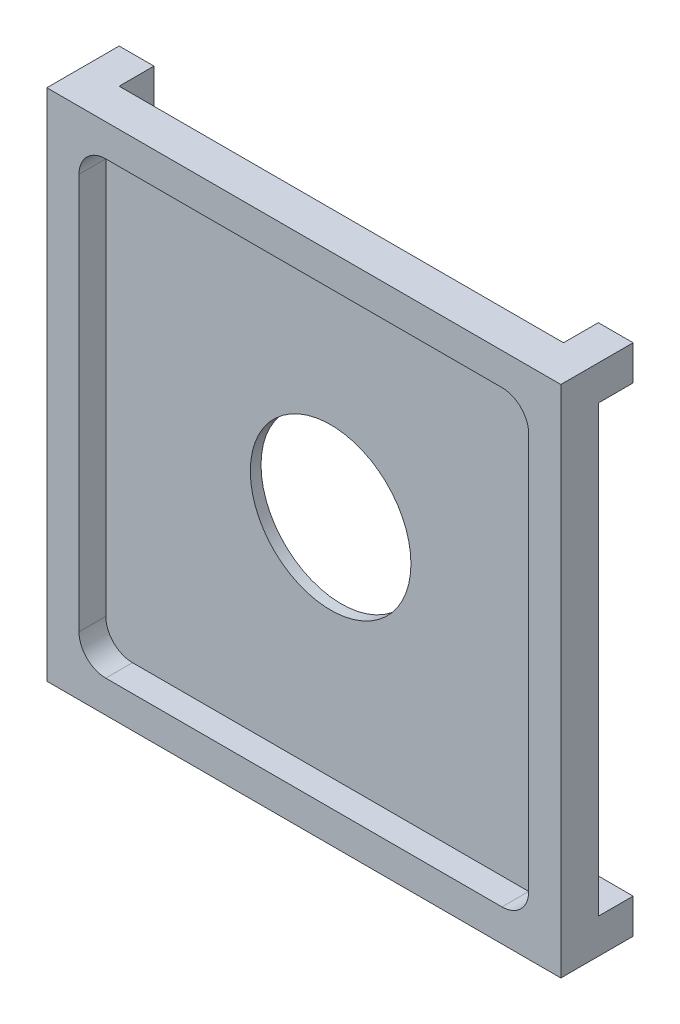
ISO-10303-21;
HEADER;
FILE_DESCRIPTION(('STEP AP214'),'2;1');
FILE_NAME('part.step','',(''),(''),'','','');
FILE_SCHEMA(('AUTOMOTIVE_DESIGN { 1 0 10303 214 1 1 1 1 }'));
ENDSEC;
DATA;
#1=APPLICATION_CONTEXT('core data for automotive mechanical design processes');
#2=APPLICATION_PROTOCOL_DEFINITION('international standard','automotive_design',2000,#1);
#3=PRODUCT_CONTEXT('',#1,'mechanical');
#4=PRODUCT('Part','Part','',(#3));
#5=PRODUCT_RELATED_PRODUCT_CATEGORY('part','',(#4));
#6=PRODUCT_DEFINITION_FORMATION('','',#4);
#7=PRODUCT_DEFINITION_CONTEXT('part definition',#1,'design');
#8=PRODUCT_DEFINITION('design','',#6,#7);
#9=PRODUCT_DEFINITION_SHAPE('','',#8);
#10=(LENGTH_UNIT() NAMED_UNIT(*) SI_UNIT(.MILLI.,.METRE.));
#11=(NAMED_UNIT(*) PLANE_ANGLE_UNIT() SI_UNIT($,.RADIAN.));
#12=(NAMED_UNIT(*) SI_UNIT($,.STERADIAN.) SOLID_ANGLE_UNIT());
#13=UNCERTAINTY_MEASURE_WITH_UNIT(LENGTH_MEASURE(1.E-05),#10,'distance_accuracy_value','');
#14=(GEOMETRIC_REPRESENTATION_CONTEXT(3) GLOBAL_UNCERTAINTY_ASSIGNED_CONTEXT((#13)) GLOBAL_UNIT_ASSIGNED_CONTEXT((#10,
#11,#12)) REPRESENTATION_CONTEXT('',''));
#15=CARTESIAN_POINT('',(0.,0.,0.));
#16=DIRECTION('',(0.,0.,1.));
#17=DIRECTION('',(1.,0.,0.));
#18=AXIS2_PLACEMENT_3D('',#15,#16,#17);
#19=CARTESIAN_POINT('',(0.,0.,0.));
#20=DIRECTION('',(0.,0.,1.));
#21=DIRECTION('',(1.,0.,0.));
#22=AXIS2_PLACEMENT_3D('',#19,#20,#21);
#23=PLANE('',#22);
#24=CARTESIAN_POINT('',(0.,0.,0.));
#25=DIRECTION('',(0.,0.,-1.));
#26=DIRECTION('',(-1.,0.,0.));
#27=AXIS2_PLACEMENT_3D('',#24,#25,#26);
#28=CIRCLE('',#27,15.);
#29=CARTESIAN_POINT('',(-15.,0.,0.));
#30=VERTEX_POINT('',#29);
#31=EDGE_CURVE('E431',#30,#30,#28,.T.);
#32=ORIENTED_EDGE('',*,*,#31,.F.);
#33=EDGE_LOOP('',(#32));
#34=FACE_BOUND('',#33,.T.);
#35=DIRECTION('',(1.,0.,0.));
#36=VECTOR('',#35,1.);
#37=CARTESIAN_POINT('',(-48.,-41.5,0.));
#38=LINE('',#37,#36);
#39=CARTESIAN_POINT('',(-48.,-41.5,0.));
#40=VERTEX_POINT('',#39);
#41=CARTESIAN_POINT('',(-41.5,-41.5,0.));
#42=VERTEX_POINT('',#41);
#43=EDGE_CURVE('E426',#40,#42,#38,.T.);
#44=ORIENTED_EDGE('',*,*,#43,.F.);
#45=DIRECTION('',(0.,-1.,0.));
#46=VECTOR('',#45,1.);
#47=CARTESIAN_POINT('',(-48.,-48.,0.));
#48=LINE('',#47,#46);
#49=CARTESIAN_POINT('',(-48.,41.5,0.));
#50=VERTEX_POINT('',#49);
#51=EDGE_CURVE('E226',#50,#40,#48,.T.);
#52=ORIENTED_EDGE('',*,*,#51,.F.);
#53=DIRECTION('',(-1.,0.,0.));
#54=VECTOR('',#53,1.);
#55=CARTESIAN_POINT('',(-48.,41.5,0.));
#56=LINE('',#55,#54);
#57=CARTESIAN_POINT('',(-41.5,41.5,0.));
#58=VERTEX_POINT('',#57);
#59=EDGE_CURVE('E256',#58,#50,#56,.T.);
#60=ORIENTED_EDGE('',*,*,#59,.F.);
#61=DIRECTION('',(0.,-1.,0.));
#62=VECTOR('',#61,1.);
#63=CARTESIAN_POINT('',(-41.5,48.,0.));
#64=LINE('',#63,#62);
#65=CARTESIAN_POINT('',(-41.5,48.,0.));
#66=VERTEX_POINT('',#65);
#67=EDGE_CURVE('E251',#66,#58,#64,.T.);
#68=ORIENTED_EDGE('',*,*,#67,.F.);
#69=DIRECTION('',(-1.,0.,0.));
#70=VECTOR('',#69,1.);
#71=CARTESIAN_POINT('',(48.,48.,0.));
#72=LINE('',#71,#70);
#73=CARTESIAN_POINT('',(41.5,48.,0.));
#74=VERTEX_POINT('',#73);
#75=EDGE_CURVE('E370',#74,#66,#72,.T.);
#76=ORIENTED_EDGE('',*,*,#75,.F.);
#77=DIRECTION('',(0.,1.,0.));
#78=VECTOR('',#77,1.);
#79=CARTESIAN_POINT('',(41.5,48.,0.));
#80=LINE('',#79,#78);
#81=CARTESIAN_POINT('',(41.5,41.5,0.));
#82=VERTEX_POINT('',#81);
#83=EDGE_CURVE('E276',#82,#74,#80,.T.);
#84=ORIENTED_EDGE('',*,*,#83,.F.);
#85=DIRECTION('',(-1.,0.,0.));
#86=VECTOR('',#85,1.);
#87=CARTESIAN_POINT('',(48.,41.5,0.));
#88=LINE('',#87,#86);
#89=CARTESIAN_POINT('',(48.,41.5,0.));
#90=VERTEX_POINT('',#89);
#91=EDGE_CURVE('E271',#90,#82,#88,.T.);
#92=ORIENTED_EDGE('',*,*,#91,.F.);
#93=DIRECTION('',(0.,1.,0.));
#94=VECTOR('',#93,1.);
#95=CARTESIAN_POINT('',(48.,-48.,0.));
#96=LINE('',#95,#94);
#97=CARTESIAN_POINT('',(48.,-41.5,0.));
#98=VERTEX_POINT('',#97);
#99=EDGE_CURVE('E368',#98,#90,#96,.T.);
#100=ORIENTED_EDGE('',*,*,#99,.F.);
#101=DIRECTION('',(1.,0.,0.));
#102=VECTOR('',#101,1.);
#103=CARTESIAN_POINT('',(48.,-41.5,0.));
#104=LINE('',#103,#102);
#105=CARTESIAN_POINT('',(41.5,-41.5,0.));
#106=VERTEX_POINT('',#105);
#107=EDGE_CURVE('E229',#106,#98,#104,.T.);
#108=ORIENTED_EDGE('',*,*,#107,.F.);
#109=DIRECTION('',(0.,1.,0.));
#110=VECTOR('',#109,1.);
#111=CARTESIAN_POINT('',(41.5,-48.,0.));
#112=LINE('',#111,#110);
#113=CARTESIAN_POINT('',(41.5,-48.,0.));
#114=VERTEX_POINT('',#113);
#115=EDGE_CURVE('E227',#114,#106,#112,.T.);
#116=ORIENTED_EDGE('',*,*,#115,.F.);
#117=DIRECTION('',(1.,0.,0.));
#118=VECTOR('',#117,1.);
#119=CARTESIAN_POINT('',(48.,-48.,0.));
#120=LINE('',#119,#118);
#121=CARTESIAN_POINT('',(-41.5,-48.,0.));
#122=VERTEX_POINT('',#121);
#123=EDGE_CURVE('E366',#122,#114,#120,.T.);
#124=ORIENTED_EDGE('',*,*,#123,.F.);
#125=DIRECTION('',(0.,-1.,0.));
#126=VECTOR('',#125,1.);
#127=CARTESIAN_POINT('',(-41.5,-48.,0.));
#128=LINE('',#127,#126);
#129=EDGE_CURVE('E221',#42,#122,#128,.T.);
#130=ORIENTED_EDGE('',*,*,#129,.F.);
#131=EDGE_LOOP('',(#44,#52,#60,#68,#76,#84,#92,#100,#108,#116,#124,#130));
#132=FACE_BOUND('',#131,.T.);
#133=ADVANCED_FACE('F41',(#34,#132),#23,.F.);
#134=CARTESIAN_POINT('',(-48.,-48.,2.));
#135=DIRECTION('',(1.,0.,0.));
#136=DIRECTION('',(0.,0.,-1.));
#137=AXIS2_PLACEMENT_3D('',#134,#135,#136);
#138=PLANE('',#137);
#139=DIRECTION('',(0.,0.,-1.));
#140=VECTOR('',#139,1.);
#141=CARTESIAN_POINT('',(-48.,48.,2.));
#142=LINE('',#141,#140);
#143=CARTESIAN_POINT('',(-48.,48.,7.));
#144=VERTEX_POINT('',#143);
#145=CARTESIAN_POINT('',(-48.,48.,-6.5));
#146=VERTEX_POINT('',#145);
#147=EDGE_CURVE('E373',#144,#146,#142,.T.);
#148=ORIENTED_EDGE('',*,*,#147,.T.);
#149=DIRECTION('',(0.,1.,0.));
#150=VECTOR('',#149,1.);
#151=CARTESIAN_POINT('',(-48.,48.,-6.5));
#152=LINE('',#151,#150);
#153=CARTESIAN_POINT('',(-48.,41.5,-6.5));
#154=VERTEX_POINT('',#153);
#155=EDGE_CURVE('E252',#154,#146,#152,.T.);
#156=ORIENTED_EDGE('',*,*,#155,.F.);
#157=DIRECTION('',(0.,0.,1.));
#158=VECTOR('',#157,1.);
#159=CARTESIAN_POINT('',(-48.,41.5,-6.5));
#160=LINE('',#159,#158);
#161=EDGE_CURVE('E262',#154,#50,#160,.T.);
#162=ORIENTED_EDGE('',*,*,#161,.T.);
#163=ORIENTED_EDGE('',*,*,#51,.T.);
#164=DIRECTION('',(0.,0.,1.));
#165=VECTOR('',#164,1.);
#166=CARTESIAN_POINT('',(-48.,-41.5,-6.5));
#167=LINE('',#166,#165);
#168=CARTESIAN_POINT('',(-48.,-41.5,-6.5));
#169=VERTEX_POINT('',#168);
#170=EDGE_CURVE('E207',#169,#40,#167,.T.);
#171=ORIENTED_EDGE('',*,*,#170,.F.);
#172=DIRECTION('',(0.,1.,0.));
#173=VECTOR('',#172,1.);
#174=CARTESIAN_POINT('',(-48.,-48.,-6.5));
#175=LINE('',#174,#173);
#176=CARTESIAN_POINT('',(-48.,-48.,-6.5));
#177=VERTEX_POINT('',#176);
#178=EDGE_CURVE('E214',#177,#169,#175,.T.);
#179=ORIENTED_EDGE('',*,*,#178,.F.);
#180=DIRECTION('',(0.,0.,-1.));
#181=VECTOR('',#180,1.);
#182=CARTESIAN_POINT('',(-48.,-48.,2.));
#183=LINE('',#182,#181);
#184=CARTESIAN_POINT('',(-48.,-48.,7.));
#185=VERTEX_POINT('',#184);
#186=EDGE_CURVE('E11',#185,#177,#183,.T.);
#187=ORIENTED_EDGE('',*,*,#186,.F.);
#188=DIRECTION('',(0.,-1.,0.));
#189=VECTOR('',#188,1.);
#190=CARTESIAN_POINT('',(-48.,48.,7.));
#191=LINE('',#190,#189);
#192=EDGE_CURVE('E356',#144,#185,#191,.T.);
#193=ORIENTED_EDGE('',*,*,#192,.F.);
#194=EDGE_LOOP('',(#148,#156,#162,#163,#171,#179,#187,#193));
#195=FACE_BOUND('',#194,.T.);
#196=ADVANCED_FACE('F43',(#195),#138,.F.);
#197=CARTESIAN_POINT('',(48.,-48.,2.));
#198=DIRECTION('',(0.,1.,0.));
#199=DIRECTION('',(-1.,0.,0.));
#200=AXIS2_PLACEMENT_3D('',#197,#198,#199);
#201=PLANE('',#200);
#202=ORIENTED_EDGE('',*,*,#186,.T.);
#203=DIRECTION('',(-1.,0.,0.));
#204=VECTOR('',#203,1.);
#205=CARTESIAN_POINT('',(-48.,-48.,-6.5));
#206=LINE('',#205,#204);
#207=CARTESIAN_POINT('',(-41.5,-48.,-6.5));
#208=VERTEX_POINT('',#207);
#209=EDGE_CURVE('E219',#208,#177,#206,.T.);
#210=ORIENTED_EDGE('',*,*,#209,.F.);
#211=DIRECTION('',(0.,0.,1.));
#212=VECTOR('',#211,1.);
#213=CARTESIAN_POINT('',(-41.5,-48.,-6.5));
#214=LINE('',#213,#212);
#215=EDGE_CURVE('E57',#208,#122,#214,.T.);
#216=ORIENTED_EDGE('',*,*,#215,.T.);
#217=ORIENTED_EDGE('',*,*,#123,.T.);
#218=DIRECTION('',(0.,0.,1.));
#219=VECTOR('',#218,1.);
#220=CARTESIAN_POINT('',(41.5,-48.,-6.5));
#221=LINE('',#220,#219);
#222=CARTESIAN_POINT('',(41.5,-48.,-6.5));
#223=VERTEX_POINT('',#222);
#224=EDGE_CURVE('E248',#223,#114,#221,.T.);
#225=ORIENTED_EDGE('',*,*,#224,.F.);
#226=DIRECTION('',(-1.,0.,0.));
#227=VECTOR('',#226,1.);
#228=CARTESIAN_POINT('',(48.,-48.,-6.5));
#229=LINE('',#228,#227);
#230=CARTESIAN_POINT('',(48.,-48.,-6.5));
#231=VERTEX_POINT('',#230);
#232=EDGE_CURVE('E237',#231,#223,#229,.T.);
#233=ORIENTED_EDGE('',*,*,#232,.F.);
#234=DIRECTION('',(0.,0.,-1.));
#235=VECTOR('',#234,1.);
#236=CARTESIAN_POINT('',(48.,-48.,2.));
#237=LINE('',#236,#235);
#238=CARTESIAN_POINT('',(48.,-48.,7.));
#239=VERTEX_POINT('',#238);
#240=EDGE_CURVE('E50',#239,#231,#237,.T.);
#241=ORIENTED_EDGE('',*,*,#240,.F.);
#242=DIRECTION('',(1.,0.,0.));
#243=VECTOR('',#242,1.);
#244=CARTESIAN_POINT('',(-48.,-48.,7.));
#245=LINE('',#244,#243);
#246=EDGE_CURVE('E359',#185,#239,#245,.T.);
#247=ORIENTED_EDGE('',*,*,#246,.F.);
#248=EDGE_LOOP('',(#202,#210,#216,#217,#225,#233,#241,#247));
#249=FACE_BOUND('',#248,.T.);
#250=ADVANCED_FACE('F382',(#249),#201,.F.);
#251=CARTESIAN_POINT('',(48.,-48.,2.));
#252=DIRECTION('',(-1.,0.,0.));
#253=DIRECTION('',(0.,0.,1.));
#254=AXIS2_PLACEMENT_3D('',#251,#252,#253);
#255=PLANE('',#254);
#256=ORIENTED_EDGE('',*,*,#240,.T.);
#257=DIRECTION('',(0.,-1.,0.));
#258=VECTOR('',#257,1.);
#259=CARTESIAN_POINT('',(48.,-48.,-6.5));
#260=LINE('',#259,#258);
#261=CARTESIAN_POINT('',(48.,-41.5,-6.5));
#262=VERTEX_POINT('',#261);
#263=EDGE_CURVE('E234',#262,#231,#260,.T.);
#264=ORIENTED_EDGE('',*,*,#263,.F.);
#265=DIRECTION('',(0.,0.,1.));
#266=VECTOR('',#265,1.);
#267=CARTESIAN_POINT('',(48.,-41.5,-6.5));
#268=LINE('',#267,#266);
#269=EDGE_CURVE('E65',#262,#98,#268,.T.);
#270=ORIENTED_EDGE('',*,*,#269,.T.);
#271=ORIENTED_EDGE('',*,*,#99,.T.);
#272=DIRECTION('',(0.,0.,1.));
#273=VECTOR('',#272,1.);
#274=CARTESIAN_POINT('',(48.,41.5,-6.5));
#275=LINE('',#274,#273);
#276=CARTESIAN_POINT('',(48.,41.5,-6.5));
#277=VERTEX_POINT('',#276);
#278=EDGE_CURVE('E293',#277,#90,#275,.T.);
#279=ORIENTED_EDGE('',*,*,#278,.F.);
#280=DIRECTION('',(0.,-1.,0.));
#281=VECTOR('',#280,1.);
#282=CARTESIAN_POINT('',(48.,48.,-6.5));
#283=LINE('',#282,#281);
#284=CARTESIAN_POINT('',(48.,48.,-6.5));
#285=VERTEX_POINT('',#284);
#286=EDGE_CURVE('E272',#285,#277,#283,.T.);
#287=ORIENTED_EDGE('',*,*,#286,.F.);
#288=DIRECTION('',(0.,0.,-1.));
#289=VECTOR('',#288,1.);
#290=CARTESIAN_POINT('',(48.,48.,2.));
#291=LINE('',#290,#289);
#292=CARTESIAN_POINT('',(48.,48.,7.));
#293=VERTEX_POINT('',#292);
#294=EDGE_CURVE('E375',#293,#285,#291,.T.);
#295=ORIENTED_EDGE('',*,*,#294,.F.);
#296=DIRECTION('',(0.,1.,0.));
#297=VECTOR('',#296,1.);
#298=CARTESIAN_POINT('',(48.,-48.,7.));
#299=LINE('',#298,#297);
#300=EDGE_CURVE('E362',#239,#293,#299,.T.);
#301=ORIENTED_EDGE('',*,*,#300,.F.);
#302=EDGE_LOOP('',(#256,#264,#270,#271,#279,#287,#295,#301));
#303=FACE_BOUND('',#302,.T.);
#304=ADVANCED_FACE('F379',(#303),#255,.F.);
#305=CARTESIAN_POINT('',(48.,48.,2.));
#306=DIRECTION('',(0.,-1.,0.));
#307=DIRECTION('',(1.,0.,0.));
#308=AXIS2_PLACEMENT_3D('',#305,#306,#307);
#309=PLANE('',#308);
#310=ORIENTED_EDGE('',*,*,#294,.T.);
#311=DIRECTION('',(1.,0.,0.));
#312=VECTOR('',#311,1.);
#313=CARTESIAN_POINT('',(48.,48.,-6.5));
#314=LINE('',#313,#312);
#315=CARTESIAN_POINT('',(41.5,48.,-6.5));
#316=VERTEX_POINT('',#315);
#317=EDGE_CURVE('E280',#316,#285,#314,.T.);
#318=ORIENTED_EDGE('',*,*,#317,.F.);
#319=DIRECTION('',(0.,0.,1.));
#320=VECTOR('',#319,1.);
#321=CARTESIAN_POINT('',(41.5,48.,-6.5));
#322=LINE('',#321,#320);
#323=EDGE_CURVE('E283',#316,#74,#322,.T.);
#324=ORIENTED_EDGE('',*,*,#323,.T.);
#325=ORIENTED_EDGE('',*,*,#75,.T.);
#326=DIRECTION('',(0.,0.,1.));
#327=VECTOR('',#326,1.);
#328=CARTESIAN_POINT('',(-41.5,48.,-6.5));
#329=LINE('',#328,#327);
#330=CARTESIAN_POINT('',(-41.5,48.,-6.5));
#331=VERTEX_POINT('',#330);
#332=EDGE_CURVE('E269',#331,#66,#329,.T.);
#333=ORIENTED_EDGE('',*,*,#332,.F.);
#334=DIRECTION('',(1.,0.,0.));
#335=VECTOR('',#334,1.);
#336=CARTESIAN_POINT('',(-48.,48.,-6.5));
#337=LINE('',#336,#335);
#338=EDGE_CURVE('E255',#146,#331,#337,.T.);
#339=ORIENTED_EDGE('',*,*,#338,.F.);
#340=ORIENTED_EDGE('',*,*,#147,.F.);
#341=DIRECTION('',(-1.,0.,0.));
#342=VECTOR('',#341,1.);
#343=CARTESIAN_POINT('',(48.,48.,7.));
#344=LINE('',#343,#342);
#345=EDGE_CURVE('E353',#293,#144,#344,.T.);
#346=ORIENTED_EDGE('',*,*,#345,.F.);
#347=EDGE_LOOP('',(#310,#318,#324,#325,#333,#339,#340,#346));
#348=FACE_BOUND('',#347,.T.);
#349=ADVANCED_FACE('F406',(#348),#309,.F.);
#350=CARTESIAN_POINT('',(0.,0.,7.));
#351=DIRECTION('',(0.,0.,1.));
#352=DIRECTION('',(1.,0.,0.));
#353=AXIS2_PLACEMENT_3D('',#350,#351,#352);
#354=PLANE('',#353);
#355=ORIENTED_EDGE('',*,*,#345,.T.);
#356=ORIENTED_EDGE('',*,*,#192,.T.);
#357=ORIENTED_EDGE('',*,*,#246,.T.);
#358=ORIENTED_EDGE('',*,*,#300,.T.);
#359=EDGE_LOOP('',(#355,#356,#357,#358));
#360=FACE_BOUND('',#359,.T.);
#361=DIRECTION('',(1.,0.,0.));
#362=VECTOR('',#361,1.);
#363=CARTESIAN_POINT('',(37.,-42.,7.));
#364=LINE('',#363,#362);
#365=CARTESIAN_POINT('',(-37.,-42.,7.));
#366=VERTEX_POINT('',#365);
#367=CARTESIAN_POINT('',(37.,-42.,7.));
#368=VERTEX_POINT('',#367);
#369=EDGE_CURVE('E299',#366,#368,#364,.T.);
#370=ORIENTED_EDGE('',*,*,#369,.F.);
#371=CARTESIAN_POINT('',(-37.,-37.,7.));
#372=DIRECTION('',(0.,0.,1.));
#373=DIRECTION('',(-1.,0.,0.));
#374=AXIS2_PLACEMENT_3D('',#371,#372,#373);
#375=CIRCLE('',#374,5.);
#376=CARTESIAN_POINT('',(-42.,-37.,7.));
#377=VERTEX_POINT('',#376);
#378=EDGE_CURVE('E297',#377,#366,#375,.T.);
#379=ORIENTED_EDGE('',*,*,#378,.F.);
#380=DIRECTION('',(0.,-1.,0.));
#381=VECTOR('',#380,1.);
#382=CARTESIAN_POINT('',(-42.,-37.,7.));
#383=LINE('',#382,#381);
#384=CARTESIAN_POINT('',(-42.,37.,7.));
#385=VERTEX_POINT('',#384);
#386=EDGE_CURVE('E313',#385,#377,#383,.T.);
#387=ORIENTED_EDGE('',*,*,#386,.F.);
#388=CARTESIAN_POINT('',(-37.,37.,7.));
#389=DIRECTION('',(0.,0.,1.));
#390=DIRECTION('',(1.,0.,0.));
#391=AXIS2_PLACEMENT_3D('',#388,#389,#390);
#392=CIRCLE('',#391,5.);
#393=CARTESIAN_POINT('',(-37.,42.,7.));
#394=VERTEX_POINT('',#393);
#395=EDGE_CURVE('E310',#394,#385,#392,.T.);
#396=ORIENTED_EDGE('',*,*,#395,.F.);
#397=DIRECTION('',(-1.,0.,0.));
#398=VECTOR('',#397,1.);
#399=CARTESIAN_POINT('',(37.,42.,7.));
#400=LINE('',#399,#398);
#401=CARTESIAN_POINT('',(37.,42.,7.));
#402=VERTEX_POINT('',#401);
#403=EDGE_CURVE('E308',#402,#394,#400,.T.);
#404=ORIENTED_EDGE('',*,*,#403,.F.);
#405=CARTESIAN_POINT('',(37.,37.,7.));
#406=DIRECTION('',(0.,0.,1.));
#407=DIRECTION('',(1.,0.,0.));
#408=AXIS2_PLACEMENT_3D('',#405,#406,#407);
#409=CIRCLE('',#408,5.);
#410=CARTESIAN_POINT('',(42.,37.,7.));
#411=VERTEX_POINT('',#410);
#412=EDGE_CURVE('E306',#411,#402,#409,.T.);
#413=ORIENTED_EDGE('',*,*,#412,.F.);
#414=DIRECTION('',(0.,1.,0.));
#415=VECTOR('',#414,1.);
#416=CARTESIAN_POINT('',(42.,-37.,7.));
#417=LINE('',#416,#415);
#418=CARTESIAN_POINT('',(42.,-37.,7.));
#419=VERTEX_POINT('',#418);
#420=EDGE_CURVE('E304',#419,#411,#417,.T.);
#421=ORIENTED_EDGE('',*,*,#420,.F.);
#422=CARTESIAN_POINT('',(37.,-37.,7.));
#423=DIRECTION('',(0.,0.,1.));
#424=DIRECTION('',(1.,0.,0.));
#425=AXIS2_PLACEMENT_3D('',#422,#423,#424);
#426=CIRCLE('',#425,5.);
#427=EDGE_CURVE('E302',#368,#419,#426,.T.);
#428=ORIENTED_EDGE('',*,*,#427,.F.);
#429=EDGE_LOOP('',(#370,#379,#387,#396,#404,#413,#421,#428));
#430=FACE_BOUND('',#429,.T.);
#431=ADVANCED_FACE('F409',(#360,#430),#354,.T.);
#432=CARTESIAN_POINT('',(-37.,-37.,7.));
#433=DIRECTION('',(0.,0.,-1.));
#434=DIRECTION('',(-1.,0.,0.));
#435=AXIS2_PLACEMENT_3D('',#432,#433,#434);
#436=CYLINDRICAL_SURFACE('',#435,5.);
#437=CARTESIAN_POINT('',(-37.,-37.,2.));
#438=DIRECTION('',(0.,0.,1.));
#439=DIRECTION('',(-1.,0.,0.));
#440=AXIS2_PLACEMENT_3D('',#437,#438,#439);
#441=CIRCLE('',#440,5.);
#442=CARTESIAN_POINT('',(-42.,-37.,2.));
#443=VERTEX_POINT('',#442);
#444=CARTESIAN_POINT('',(-37.,-42.,2.));
#445=VERTEX_POINT('',#444);
#446=EDGE_CURVE('E296',#443,#445,#441,.T.);
#447=ORIENTED_EDGE('',*,*,#446,.F.);
#448=DIRECTION('',(0.,0.,-1.));
#449=VECTOR('',#448,1.);
#450=CARTESIAN_POINT('',(-42.,-37.,7.));
#451=LINE('',#450,#449);
#452=EDGE_CURVE('E315',#377,#443,#451,.T.);
#453=ORIENTED_EDGE('',*,*,#452,.F.);
#454=ORIENTED_EDGE('',*,*,#378,.T.);
#455=DIRECTION('',(0.,0.,-1.));
#456=VECTOR('',#455,1.);
#457=CARTESIAN_POINT('',(-37.,-42.,7.));
#458=LINE('',#457,#456);
#459=EDGE_CURVE('E350',#366,#445,#458,.T.);
#460=ORIENTED_EDGE('',*,*,#459,.T.);
#461=EDGE_LOOP('',(#447,#453,#454,#460));
#462=FACE_BOUND('',#461,.T.);
#463=ADVANCED_FACE('F468',(#462),#436,.F.);
#464=CARTESIAN_POINT('',(37.,-42.,7.));
#465=DIRECTION('',(0.,1.,0.));
#466=DIRECTION('',(0.,0.,1.));
#467=AXIS2_PLACEMENT_3D('',#464,#465,#466);
#468=PLANE('',#467);
#469=DIRECTION('',(1.,0.,0.));
#470=VECTOR('',#469,1.);
#471=CARTESIAN_POINT('',(37.,-42.,2.));
#472=LINE('',#471,#470);
#473=CARTESIAN_POINT('',(37.,-42.,2.));
#474=VERTEX_POINT('',#473);
#475=EDGE_CURVE('E317',#445,#474,#472,.T.);
#476=ORIENTED_EDGE('',*,*,#475,.F.);
#477=ORIENTED_EDGE('',*,*,#459,.F.);
#478=ORIENTED_EDGE('',*,*,#369,.T.);
#479=DIRECTION('',(0.,0.,-1.));
#480=VECTOR('',#479,1.);
#481=CARTESIAN_POINT('',(37.,-42.,7.));
#482=LINE('',#481,#480);
#483=EDGE_CURVE('E347',#368,#474,#482,.T.);
#484=ORIENTED_EDGE('',*,*,#483,.T.);
#485=EDGE_LOOP('',(#476,#477,#478,#484));
#486=FACE_BOUND('',#485,.T.);
#487=ADVANCED_FACE('F473',(#486),#468,.T.);
#488=CARTESIAN_POINT('',(37.,-37.,7.));
#489=DIRECTION('',(0.,0.,-1.));
#490=DIRECTION('',(-1.,0.,0.));
#491=AXIS2_PLACEMENT_3D('',#488,#489,#490);
#492=CYLINDRICAL_SURFACE('',#491,5.);
#493=CARTESIAN_POINT('',(37.,-37.,2.));
#494=DIRECTION('',(0.,0.,1.));
#495=DIRECTION('',(1.,0.,0.));
#496=AXIS2_PLACEMENT_3D('',#493,#494,#495);
#497=CIRCLE('',#496,5.);
#498=CARTESIAN_POINT('',(42.,-37.,2.));
#499=VERTEX_POINT('',#498);
#500=EDGE_CURVE('E319',#474,#499,#497,.T.);
#501=ORIENTED_EDGE('',*,*,#500,.F.);
#502=ORIENTED_EDGE('',*,*,#483,.F.);
#503=ORIENTED_EDGE('',*,*,#427,.T.);
#504=DIRECTION('',(0.,0.,-1.));
#505=VECTOR('',#504,1.);
#506=CARTESIAN_POINT('',(42.,-37.,7.));
#507=LINE('',#506,#505);
#508=EDGE_CURVE('E344',#419,#499,#507,.T.);
#509=ORIENTED_EDGE('',*,*,#508,.T.);
#510=EDGE_LOOP('',(#501,#502,#503,#509));
#511=FACE_BOUND('',#510,.T.);
#512=ADVANCED_FACE('F480',(#511),#492,.F.);
#513=CARTESIAN_POINT('',(42.,-37.,7.));
#514=DIRECTION('',(-1.,0.,0.));
#515=DIRECTION('',(0.,0.,1.));
#516=AXIS2_PLACEMENT_3D('',#513,#514,#515);
#517=PLANE('',#516);
#518=DIRECTION('',(0.,1.,0.));
#519=VECTOR('',#518,1.);
#520=CARTESIAN_POINT('',(42.,-37.,2.));
#521=LINE('',#520,#519);
#522=CARTESIAN_POINT('',(42.,37.,2.));
#523=VERTEX_POINT('',#522);
#524=EDGE_CURVE('E321',#499,#523,#521,.T.);
#525=ORIENTED_EDGE('',*,*,#524,.F.);
#526=ORIENTED_EDGE('',*,*,#508,.F.);
#527=ORIENTED_EDGE('',*,*,#420,.T.);
#528=DIRECTION('',(0.,0.,-1.));
#529=VECTOR('',#528,1.);
#530=CARTESIAN_POINT('',(42.,37.,7.));
#531=LINE('',#530,#529);
#532=EDGE_CURVE('E341',#411,#523,#531,.T.);
#533=ORIENTED_EDGE('',*,*,#532,.T.);
#534=EDGE_LOOP('',(#525,#526,#527,#533));
#535=FACE_BOUND('',#534,.T.);
#536=ADVANCED_FACE('F487',(#535),#517,.T.);
#537=CARTESIAN_POINT('',(37.,37.,7.));
#538=DIRECTION('',(0.,0.,-1.));
#539=DIRECTION('',(-1.,0.,0.));
#540=AXIS2_PLACEMENT_3D('',#537,#538,#539);
#541=CYLINDRICAL_SURFACE('',#540,5.);
#542=CARTESIAN_POINT('',(37.,37.,2.));
#543=DIRECTION('',(0.,0.,1.));
#544=DIRECTION('',(1.,0.,0.));
#545=AXIS2_PLACEMENT_3D('',#542,#543,#544);
#546=CIRCLE('',#545,5.);
#547=CARTESIAN_POINT('',(37.,42.,2.));
#548=VERTEX_POINT('',#547);
#549=EDGE_CURVE('E323',#523,#548,#546,.T.);
#550=ORIENTED_EDGE('',*,*,#549,.F.);
#551=ORIENTED_EDGE('',*,*,#532,.F.);
#552=ORIENTED_EDGE('',*,*,#412,.T.);
#553=DIRECTION('',(0.,0.,-1.));
#554=VECTOR('',#553,1.);
#555=CARTESIAN_POINT('',(37.,42.,7.));
#556=LINE('',#555,#554);
#557=EDGE_CURVE('E338',#402,#548,#556,.T.);
#558=ORIENTED_EDGE('',*,*,#557,.T.);
#559=EDGE_LOOP('',(#550,#551,#552,#558));
#560=FACE_BOUND('',#559,.T.);
#561=ADVANCED_FACE('F494',(#560),#541,.F.);
#562=CARTESIAN_POINT('',(37.,42.,7.));
#563=DIRECTION('',(0.,-1.,0.));
#564=DIRECTION('',(0.,0.,-1.));
#565=AXIS2_PLACEMENT_3D('',#562,#563,#564);
#566=PLANE('',#565);
#567=DIRECTION('',(-1.,0.,0.));
#568=VECTOR('',#567,1.);
#569=CARTESIAN_POINT('',(37.,42.,2.));
#570=LINE('',#569,#568);
#571=CARTESIAN_POINT('',(-37.,42.,2.));
#572=VERTEX_POINT('',#571);
#573=EDGE_CURVE('E325',#548,#572,#570,.T.);
#574=ORIENTED_EDGE('',*,*,#573,.F.);
#575=ORIENTED_EDGE('',*,*,#557,.F.);
#576=ORIENTED_EDGE('',*,*,#403,.T.);
#577=DIRECTION('',(0.,0.,-1.));
#578=VECTOR('',#577,1.);
#579=CARTESIAN_POINT('',(-37.,42.,7.));
#580=LINE('',#579,#578);
#581=EDGE_CURVE('E335',#394,#572,#580,.T.);
#582=ORIENTED_EDGE('',*,*,#581,.T.);
#583=EDGE_LOOP('',(#574,#575,#576,#582));
#584=FACE_BOUND('',#583,.T.);
#585=ADVANCED_FACE('F501',(#584),#566,.T.);
#586=CARTESIAN_POINT('',(-37.,37.,7.));
#587=DIRECTION('',(0.,0.,-1.));
#588=DIRECTION('',(-1.,0.,0.));
#589=AXIS2_PLACEMENT_3D('',#586,#587,#588);
#590=CYLINDRICAL_SURFACE('',#589,5.);
#591=CARTESIAN_POINT('',(-37.,37.,2.));
#592=DIRECTION('',(0.,0.,1.));
#593=DIRECTION('',(1.,0.,0.));
#594=AXIS2_PLACEMENT_3D('',#591,#592,#593);
#595=CIRCLE('',#594,5.);
#596=CARTESIAN_POINT('',(-42.,37.,2.));
#597=VERTEX_POINT('',#596);
#598=EDGE_CURVE('E327',#572,#597,#595,.T.);
#599=ORIENTED_EDGE('',*,*,#598,.F.);
#600=ORIENTED_EDGE('',*,*,#581,.F.);
#601=ORIENTED_EDGE('',*,*,#395,.T.);
#602=DIRECTION('',(0.,0.,-1.));
#603=VECTOR('',#602,1.);
#604=CARTESIAN_POINT('',(-42.,37.,7.));
#605=LINE('',#604,#603);
#606=EDGE_CURVE('E332',#385,#597,#605,.T.);
#607=ORIENTED_EDGE('',*,*,#606,.T.);
#608=EDGE_LOOP('',(#599,#600,#601,#607));
#609=FACE_BOUND('',#608,.T.);
#610=ADVANCED_FACE('F508',(#609),#590,.F.);
#611=CARTESIAN_POINT('',(-42.,-37.,7.));
#612=DIRECTION('',(1.,0.,0.));
#613=DIRECTION('',(0.,0.,-1.));
#614=AXIS2_PLACEMENT_3D('',#611,#612,#613);
#615=PLANE('',#614);
#616=DIRECTION('',(0.,-1.,0.));
#617=VECTOR('',#616,1.);
#618=CARTESIAN_POINT('',(-42.,-37.,2.));
#619=LINE('',#618,#617);
#620=EDGE_CURVE('E300',#597,#443,#619,.T.);
#621=ORIENTED_EDGE('',*,*,#620,.F.);
#622=ORIENTED_EDGE('',*,*,#606,.F.);
#623=ORIENTED_EDGE('',*,*,#386,.T.);
#624=ORIENTED_EDGE('',*,*,#452,.T.);
#625=EDGE_LOOP('',(#621,#622,#623,#624));
#626=FACE_BOUND('',#625,.T.);
#627=ADVANCED_FACE('F515',(#626),#615,.T.);
#628=CARTESIAN_POINT('',(0.,0.,2.));
#629=DIRECTION('',(0.,0.,1.));
#630=DIRECTION('',(1.,0.,0.));
#631=AXIS2_PLACEMENT_3D('',#628,#629,#630);
#632=PLANE('',#631);
#633=CARTESIAN_POINT('',(0.,0.,2.));
#634=DIRECTION('',(0.,0.,1.));
#635=DIRECTION('',(1.,0.,0.));
#636=AXIS2_PLACEMENT_3D('',#633,#634,#635);
#637=CIRCLE('',#636,15.);
#638=CARTESIAN_POINT('',(15.,0.,2.));
#639=VERTEX_POINT('',#638);
#640=EDGE_CURVE('E45',#639,#639,#637,.T.);
#641=ORIENTED_EDGE('',*,*,#640,.F.);
#642=EDGE_LOOP('',(#641));
#643=FACE_BOUND('',#642,.T.);
#644=ORIENTED_EDGE('',*,*,#446,.T.);
#645=ORIENTED_EDGE('',*,*,#475,.T.);
#646=ORIENTED_EDGE('',*,*,#500,.T.);
#647=ORIENTED_EDGE('',*,*,#524,.T.);
#648=ORIENTED_EDGE('',*,*,#549,.T.);
#649=ORIENTED_EDGE('',*,*,#573,.T.);
#650=ORIENTED_EDGE('',*,*,#598,.T.);
#651=ORIENTED_EDGE('',*,*,#620,.T.);
#652=EDGE_LOOP('',(#644,#645,#646,#647,#648,#649,#650,#651));
#653=FACE_BOUND('',#652,.T.);
#654=ADVANCED_FACE('F447',(#643,#653),#632,.T.);
#655=CARTESIAN_POINT('',(48.,41.5,-6.5));
#656=DIRECTION('',(0.,1.,0.));
#657=DIRECTION('',(0.,0.,1.));
#658=AXIS2_PLACEMENT_3D('',#655,#656,#657);
#659=PLANE('',#658);
#660=ORIENTED_EDGE('',*,*,#91,.T.);
#661=DIRECTION('',(0.,0.,1.));
#662=VECTOR('',#661,1.);
#663=CARTESIAN_POINT('',(41.5,41.5,-6.5));
#664=LINE('',#663,#662);
#665=CARTESIAN_POINT('',(41.5,41.5,-6.5));
#666=VERTEX_POINT('',#665);
#667=EDGE_CURVE('E290',#666,#82,#664,.T.);
#668=ORIENTED_EDGE('',*,*,#667,.F.);
#669=DIRECTION('',(-1.,0.,0.));
#670=VECTOR('',#669,1.);
#671=CARTESIAN_POINT('',(48.,41.5,-6.5));
#672=LINE('',#671,#670);
#673=EDGE_CURVE('E275',#277,#666,#672,.T.);
#674=ORIENTED_EDGE('',*,*,#673,.F.);
#675=ORIENTED_EDGE('',*,*,#278,.T.);
#676=EDGE_LOOP('',(#660,#668,#674,#675));
#677=FACE_BOUND('',#676,.T.);
#678=ADVANCED_FACE('F398',(#677),#659,.F.);
#679=CARTESIAN_POINT('',(41.5,48.,-6.5));
#680=DIRECTION('',(1.,0.,0.));
#681=DIRECTION('',(0.,0.,-1.));
#682=AXIS2_PLACEMENT_3D('',#679,#680,#681);
#683=PLANE('',#682);
#684=ORIENTED_EDGE('',*,*,#83,.T.);
#685=ORIENTED_EDGE('',*,*,#323,.F.);
#686=DIRECTION('',(0.,1.,0.));
#687=VECTOR('',#686,1.);
#688=CARTESIAN_POINT('',(41.5,48.,-6.5));
#689=LINE('',#688,#687);
#690=EDGE_CURVE('E278',#666,#316,#689,.T.);
#691=ORIENTED_EDGE('',*,*,#690,.F.);
#692=ORIENTED_EDGE('',*,*,#667,.T.);
#693=EDGE_LOOP('',(#684,#685,#691,#692));
#694=FACE_BOUND('',#693,.T.);
#695=ADVANCED_FACE('F533',(#694),#683,.F.);
#696=CARTESIAN_POINT('',(0.,0.,-6.5));
#697=DIRECTION('',(0.,0.,-1.));
#698=DIRECTION('',(-1.,0.,0.));
#699=AXIS2_PLACEMENT_3D('',#696,#697,#698);
#700=PLANE('',#699);
#701=ORIENTED_EDGE('',*,*,#286,.T.);
#702=ORIENTED_EDGE('',*,*,#673,.T.);
#703=ORIENTED_EDGE('',*,*,#690,.T.);
#704=ORIENTED_EDGE('',*,*,#317,.T.);
#705=EDGE_LOOP('',(#701,#702,#703,#704));
#706=FACE_BOUND('',#705,.T.);
#707=ADVANCED_FACE('F402',(#706),#700,.T.);
#708=CARTESIAN_POINT('',(-41.5,48.,-6.5));
#709=DIRECTION('',(-1.,0.,0.));
#710=DIRECTION('',(0.,0.,1.));
#711=AXIS2_PLACEMENT_3D('',#708,#709,#710);
#712=PLANE('',#711);
#713=ORIENTED_EDGE('',*,*,#67,.T.);
#714=DIRECTION('',(0.,0.,1.));
#715=VECTOR('',#714,1.);
#716=CARTESIAN_POINT('',(-41.5,41.5,-6.5));
#717=LINE('',#716,#715);
#718=CARTESIAN_POINT('',(-41.5,41.5,-6.5));
#719=VERTEX_POINT('',#718);
#720=EDGE_CURVE('E266',#719,#58,#717,.T.);
#721=ORIENTED_EDGE('',*,*,#720,.F.);
#722=DIRECTION('',(0.,-1.,0.));
#723=VECTOR('',#722,1.);
#724=CARTESIAN_POINT('',(-41.5,48.,-6.5));
#725=LINE('',#724,#723);
#726=EDGE_CURVE('E258',#331,#719,#725,.T.);
#727=ORIENTED_EDGE('',*,*,#726,.F.);
#728=ORIENTED_EDGE('',*,*,#332,.T.);
#729=EDGE_LOOP('',(#713,#721,#727,#728));
#730=FACE_BOUND('',#729,.T.);
#731=ADVANCED_FACE('F545',(#730),#712,.F.);
#732=CARTESIAN_POINT('',(-48.,41.5,-6.5));
#733=DIRECTION('',(0.,1.,0.));
#734=DIRECTION('',(0.,0.,1.));
#735=AXIS2_PLACEMENT_3D('',#732,#733,#734);
#736=PLANE('',#735);
#737=ORIENTED_EDGE('',*,*,#59,.T.);
#738=ORIENTED_EDGE('',*,*,#161,.F.);
#739=DIRECTION('',(-1.,0.,0.));
#740=VECTOR('',#739,1.);
#741=CARTESIAN_POINT('',(-48.,41.5,-6.5));
#742=LINE('',#741,#740);
#743=EDGE_CURVE('E260',#719,#154,#742,.T.);
#744=ORIENTED_EDGE('',*,*,#743,.F.);
#745=ORIENTED_EDGE('',*,*,#720,.T.);
#746=EDGE_LOOP('',(#737,#738,#744,#745));
#747=FACE_BOUND('',#746,.T.);
#748=ADVANCED_FACE('F422',(#747),#736,.F.);
#749=CARTESIAN_POINT('',(0.,0.,-6.5));
#750=DIRECTION('',(0.,0.,1.));
#751=DIRECTION('',(1.,0.,0.));
#752=AXIS2_PLACEMENT_3D('',#749,#750,#751);
#753=PLANE('',#752);
#754=ORIENTED_EDGE('',*,*,#155,.T.);
#755=ORIENTED_EDGE('',*,*,#338,.T.);
#756=ORIENTED_EDGE('',*,*,#726,.T.);
#757=ORIENTED_EDGE('',*,*,#743,.T.);
#758=EDGE_LOOP('',(#754,#755,#756,#757));
#759=FACE_BOUND('',#758,.T.);
#760=ADVANCED_FACE('F417',(#759),#753,.F.);
#761=CARTESIAN_POINT('',(41.5,-48.,-6.5));
#762=DIRECTION('',(1.,0.,0.));
#763=DIRECTION('',(0.,0.,-1.));
#764=AXIS2_PLACEMENT_3D('',#761,#762,#763);
#765=PLANE('',#764);
#766=ORIENTED_EDGE('',*,*,#115,.T.);
#767=DIRECTION('',(0.,0.,1.));
#768=VECTOR('',#767,1.);
#769=CARTESIAN_POINT('',(41.5,-41.5,-6.5));
#770=LINE('',#769,#768);
#771=CARTESIAN_POINT('',(41.5,-41.5,-6.5));
#772=VERTEX_POINT('',#771);
#773=EDGE_CURVE('E245',#772,#106,#770,.T.);
#774=ORIENTED_EDGE('',*,*,#773,.F.);
#775=DIRECTION('',(0.,1.,0.));
#776=VECTOR('',#775,1.);
#777=CARTESIAN_POINT('',(41.5,-48.,-6.5));
#778=LINE('',#777,#776);
#779=EDGE_CURVE('E239',#223,#772,#778,.T.);
#780=ORIENTED_EDGE('',*,*,#779,.F.);
#781=ORIENTED_EDGE('',*,*,#224,.T.);
#782=EDGE_LOOP('',(#766,#774,#780,#781));
#783=FACE_BOUND('',#782,.T.);
#784=ADVANCED_FACE('F562',(#783),#765,.F.);
#785=CARTESIAN_POINT('',(48.,-41.5,-6.5));
#786=DIRECTION('',(0.,-1.,0.));
#787=DIRECTION('',(0.,0.,-1.));
#788=AXIS2_PLACEMENT_3D('',#785,#786,#787);
#789=PLANE('',#788);
#790=ORIENTED_EDGE('',*,*,#107,.T.);
#791=ORIENTED_EDGE('',*,*,#269,.F.);
#792=DIRECTION('',(1.,0.,0.));
#793=VECTOR('',#792,1.);
#794=CARTESIAN_POINT('',(48.,-41.5,-6.5));
#795=LINE('',#794,#793);
#796=EDGE_CURVE('E241',#772,#262,#795,.T.);
#797=ORIENTED_EDGE('',*,*,#796,.F.);
#798=ORIENTED_EDGE('',*,*,#773,.T.);
#799=EDGE_LOOP('',(#790,#791,#797,#798));
#800=FACE_BOUND('',#799,.T.);
#801=ADVANCED_FACE('F389',(#800),#789,.F.);
#802=CARTESIAN_POINT('',(0.,0.,-6.5));
#803=DIRECTION('',(0.,0.,1.));
#804=DIRECTION('',(1.,0.,0.));
#805=AXIS2_PLACEMENT_3D('',#802,#803,#804);
#806=PLANE('',#805);
#807=ORIENTED_EDGE('',*,*,#263,.T.);
#808=ORIENTED_EDGE('',*,*,#232,.T.);
#809=ORIENTED_EDGE('',*,*,#779,.T.);
#810=ORIENTED_EDGE('',*,*,#796,.T.);
#811=EDGE_LOOP('',(#807,#808,#809,#810));
#812=FACE_BOUND('',#811,.T.);
#813=ADVANCED_FACE('F385',(#812),#806,.F.);
#814=CARTESIAN_POINT('',(-48.,-41.5,-6.5));
#815=DIRECTION('',(0.,-1.,0.));
#816=DIRECTION('',(0.,0.,-1.));
#817=AXIS2_PLACEMENT_3D('',#814,#815,#816);
#818=PLANE('',#817);
#819=ORIENTED_EDGE('',*,*,#43,.T.);
#820=DIRECTION('',(0.,0.,1.));
#821=VECTOR('',#820,1.);
#822=CARTESIAN_POINT('',(-41.5,-41.5,-6.5));
#823=LINE('',#822,#821);
#824=CARTESIAN_POINT('',(-41.5,-41.5,-6.5));
#825=VERTEX_POINT('',#824);
#826=EDGE_CURVE('E210',#825,#42,#823,.T.);
#827=ORIENTED_EDGE('',*,*,#826,.F.);
#828=DIRECTION('',(1.,0.,0.));
#829=VECTOR('',#828,1.);
#830=CARTESIAN_POINT('',(-48.,-41.5,-6.5));
#831=LINE('',#830,#829);
#832=EDGE_CURVE('E203',#169,#825,#831,.T.);
#833=ORIENTED_EDGE('',*,*,#832,.F.);
#834=ORIENTED_EDGE('',*,*,#170,.T.);
#835=EDGE_LOOP('',(#819,#827,#833,#834));
#836=FACE_BOUND('',#835,.T.);
#837=ADVANCED_FACE('F205',(#836),#818,.F.);
#838=CARTESIAN_POINT('',(-41.5,-48.,-6.5));
#839=DIRECTION('',(-1.,0.,0.));
#840=DIRECTION('',(0.,0.,1.));
#841=AXIS2_PLACEMENT_3D('',#838,#839,#840);
#842=PLANE('',#841);
#843=ORIENTED_EDGE('',*,*,#129,.T.);
#844=ORIENTED_EDGE('',*,*,#215,.F.);
#845=DIRECTION('',(0.,-1.,0.));
#846=VECTOR('',#845,1.);
#847=CARTESIAN_POINT('',(-41.5,-48.,-6.5));
#848=LINE('',#847,#846);
#849=EDGE_CURVE('E213',#825,#208,#848,.T.);
#850=ORIENTED_EDGE('',*,*,#849,.F.);
#851=ORIENTED_EDGE('',*,*,#826,.T.);
#852=EDGE_LOOP('',(#843,#844,#850,#851));
#853=FACE_BOUND('',#852,.T.);
#854=ADVANCED_FACE('F584',(#853),#842,.F.);
#855=CARTESIAN_POINT('',(0.,0.,-6.5));
#856=DIRECTION('',(0.,0.,-1.));
#857=DIRECTION('',(-1.,0.,0.));
#858=AXIS2_PLACEMENT_3D('',#855,#856,#857);
#859=PLANE('',#858);
#860=ORIENTED_EDGE('',*,*,#178,.T.);
#861=ORIENTED_EDGE('',*,*,#832,.T.);
#862=ORIENTED_EDGE('',*,*,#849,.T.);
#863=ORIENTED_EDGE('',*,*,#209,.T.);
#864=EDGE_LOOP('',(#860,#861,#862,#863));
#865=FACE_BOUND('',#864,.T.);
#866=ADVANCED_FACE('F218',(#865),#859,.T.);
#867=CARTESIAN_POINT('',(0.,0.,10.));
#868=DIRECTION('',(0.,0.,-1.));
#869=DIRECTION('',(-1.,0.,0.));
#870=AXIS2_PLACEMENT_3D('',#867,#868,#869);
#871=CYLINDRICAL_SURFACE('',#870,15.);
#872=ORIENTED_EDGE('',*,*,#640,.T.);
#873=EDGE_LOOP('',(#872));
#874=FACE_BOUND('',#873,.T.);
#875=ORIENTED_EDGE('',*,*,#31,.T.);
#876=EDGE_LOOP('',(#875));
#877=FACE_BOUND('',#876,.T.);
#878=ADVANCED_FACE('F438',(#874,#877),#871,.F.);
#879=CLOSED_SHELL('',(#133,#196,#250,#304,#349,#431,#463,#487,#512,#536,#561,#585,#610,#627,
#654,#678,#695,#707,#731,#748,#760,#784,#801,#813,#837,#854,#866,#878));
#880=MANIFOLD_SOLID_BREP('B2',#879);
#881=ADVANCED_BREP_SHAPE_REPRESENTATION('',(#18,#880),#14);
#882=SHAPE_DEFINITION_REPRESENTATION(#9,#881);
ENDSEC;
END-ISO-10303-21;
